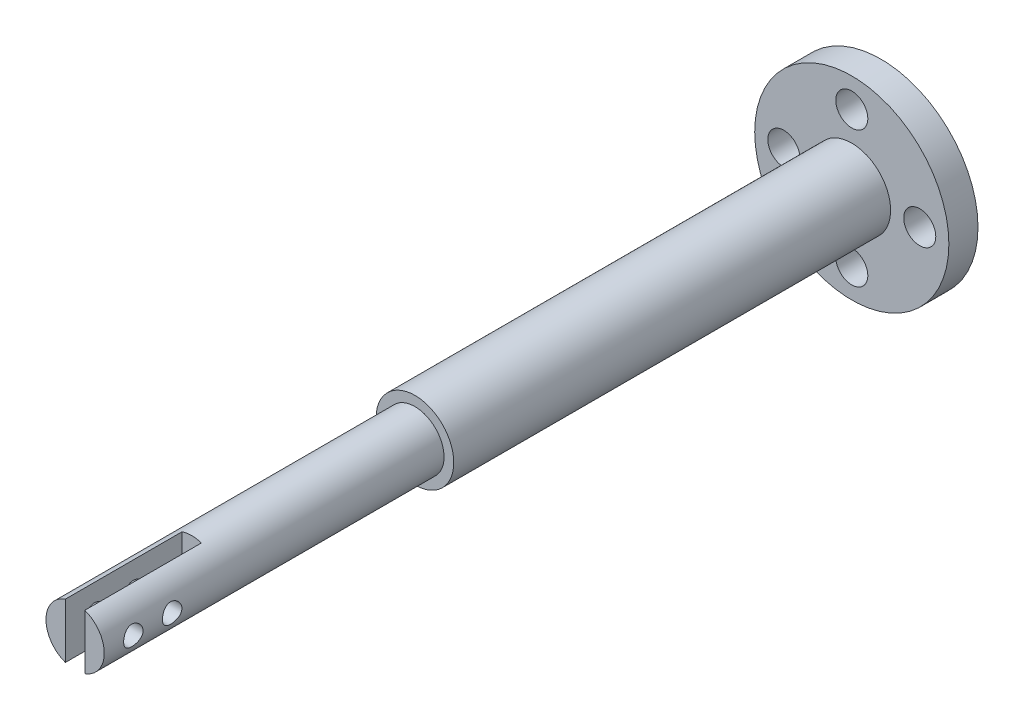
ISO-10303-21;
HEADER;
FILE_DESCRIPTION(('STEP AP214'),'2;1');
FILE_NAME('part.step','',(''),(''),'','','');
FILE_SCHEMA(('AUTOMOTIVE_DESIGN { 1 0 10303 214 1 1 1 1 }'));
ENDSEC;
DATA;
#1=APPLICATION_CONTEXT('core data for automotive mechanical design processes');
#2=APPLICATION_PROTOCOL_DEFINITION('international standard','automotive_design',2000,#1);
#3=PRODUCT_CONTEXT('',#1,'mechanical');
#4=PRODUCT('Part','Part','',(#3));
#5=PRODUCT_RELATED_PRODUCT_CATEGORY('part','',(#4));
#6=PRODUCT_DEFINITION_FORMATION('','',#4);
#7=PRODUCT_DEFINITION_CONTEXT('part definition',#1,'design');
#8=PRODUCT_DEFINITION('design','',#6,#7);
#9=PRODUCT_DEFINITION_SHAPE('','',#8);
#10=(LENGTH_UNIT() NAMED_UNIT(*) SI_UNIT(.MILLI.,.METRE.));
#11=(NAMED_UNIT(*) PLANE_ANGLE_UNIT() SI_UNIT($,.RADIAN.));
#12=(NAMED_UNIT(*) SI_UNIT($,.STERADIAN.) SOLID_ANGLE_UNIT());
#13=UNCERTAINTY_MEASURE_WITH_UNIT(LENGTH_MEASURE(1.E-05),#10,'distance_accuracy_value','');
#14=(GEOMETRIC_REPRESENTATION_CONTEXT(3) GLOBAL_UNCERTAINTY_ASSIGNED_CONTEXT((#13)) GLOBAL_UNIT_ASSIGNED_CONTEXT((#10,
#11,#12)) REPRESENTATION_CONTEXT('',''));
#15=CARTESIAN_POINT('',(0.,0.,0.));
#16=DIRECTION('',(0.,0.,1.));
#17=DIRECTION('',(1.,0.,0.));
#18=AXIS2_PLACEMENT_3D('',#15,#16,#17);
#19=CARTESIAN_POINT('',(0.,0.,3.));
#20=DIRECTION('',(0.,0.,1.));
#21=DIRECTION('',(1.,0.,0.));
#22=AXIS2_PLACEMENT_3D('',#19,#20,#21);
#23=PLANE('',#22);
#24=CARTESIAN_POINT('',(0.,0.,3.));
#25=DIRECTION('',(0.,0.,1.));
#26=DIRECTION('',(1.,0.,0.));
#27=AXIS2_PLACEMENT_3D('',#24,#25,#26);
#28=CIRCLE('',#27,4.);
#29=CARTESIAN_POINT('',(-4.,0.,3.));
#30=VERTEX_POINT('',#29);
#31=EDGE_CURVE('E243',#30,#30,#28,.T.);
#32=ORIENTED_EDGE('',*,*,#31,.F.);
#33=EDGE_LOOP('',(#32));
#34=FACE_BOUND('',#33,.T.);
#35=CARTESIAN_POINT('',(0.,-7.,3.));
#36=DIRECTION('',(0.,0.,1.));
#37=DIRECTION('',(1.,0.,0.));
#38=AXIS2_PLACEMENT_3D('',#35,#36,#37);
#39=CIRCLE('',#38,1.65);
#40=CARTESIAN_POINT('',(1.65,-7.,3.));
#41=VERTEX_POINT('',#40);
#42=EDGE_CURVE('E115',#41,#41,#39,.T.);
#43=ORIENTED_EDGE('',*,*,#42,.F.);
#44=EDGE_LOOP('',(#43));
#45=FACE_BOUND('',#44,.T.);
#46=CARTESIAN_POINT('',(0.,7.,3.));
#47=DIRECTION('',(0.,0.,1.));
#48=DIRECTION('',(1.,0.,0.));
#49=AXIS2_PLACEMENT_3D('',#46,#47,#48);
#50=CIRCLE('',#49,1.65);
#51=CARTESIAN_POINT('',(1.65,7.,3.));
#52=VERTEX_POINT('',#51);
#53=EDGE_CURVE('E127',#52,#52,#50,.T.);
#54=ORIENTED_EDGE('',*,*,#53,.F.);
#55=EDGE_LOOP('',(#54));
#56=FACE_BOUND('',#55,.T.);
#57=CARTESIAN_POINT('',(0.,0.,3.));
#58=DIRECTION('',(0.,0.,1.));
#59=DIRECTION('',(1.,0.,0.));
#60=AXIS2_PLACEMENT_3D('',#57,#58,#59);
#61=CIRCLE('',#60,10.);
#62=CARTESIAN_POINT('',(10.,0.,3.));
#63=VERTEX_POINT('',#62);
#64=EDGE_CURVE('E91',#63,#63,#61,.T.);
#65=ORIENTED_EDGE('',*,*,#64,.T.);
#66=EDGE_LOOP('',(#65));
#67=FACE_BOUND('',#66,.T.);
#68=CARTESIAN_POINT('',(7.,0.,3.));
#69=DIRECTION('',(0.,0.,1.));
#70=DIRECTION('',(1.,0.,0.));
#71=AXIS2_PLACEMENT_3D('',#68,#69,#70);
#72=CIRCLE('',#71,1.65);
#73=CARTESIAN_POINT('',(8.65,0.,3.));
#74=VERTEX_POINT('',#73);
#75=EDGE_CURVE('E121',#74,#74,#72,.T.);
#76=ORIENTED_EDGE('',*,*,#75,.F.);
#77=EDGE_LOOP('',(#76));
#78=FACE_BOUND('',#77,.T.);
#79=CARTESIAN_POINT('',(-7.,0.,3.));
#80=DIRECTION('',(0.,0.,1.));
#81=DIRECTION('',(1.,0.,0.));
#82=AXIS2_PLACEMENT_3D('',#79,#80,#81);
#83=CIRCLE('',#82,1.65);
#84=CARTESIAN_POINT('',(-5.35,0.,3.));
#85=VERTEX_POINT('',#84);
#86=EDGE_CURVE('E105',#85,#85,#83,.T.);
#87=ORIENTED_EDGE('',*,*,#86,.F.);
#88=EDGE_LOOP('',(#87));
#89=FACE_BOUND('',#88,.T.);
#90=ADVANCED_FACE('F40',(#34,#45,#56,#67,#78,#89),#23,.T.);
#91=CARTESIAN_POINT('',(0.,0.,0.));
#92=DIRECTION('',(0.,0.,1.));
#93=DIRECTION('',(1.,0.,0.));
#94=AXIS2_PLACEMENT_3D('',#91,#92,#93);
#95=PLANE('',#94);
#96=CARTESIAN_POINT('',(0.,0.,0.));
#97=DIRECTION('',(0.,0.,1.));
#98=DIRECTION('',(1.,0.,0.));
#99=AXIS2_PLACEMENT_3D('',#96,#97,#98);
#100=CIRCLE('',#99,10.);
#101=CARTESIAN_POINT('',(10.,0.,0.));
#102=VERTEX_POINT('',#101);
#103=EDGE_CURVE('E130',#102,#102,#100,.T.);
#104=ORIENTED_EDGE('',*,*,#103,.F.);
#105=EDGE_LOOP('',(#104));
#106=FACE_BOUND('',#105,.T.);
#107=CARTESIAN_POINT('',(0.,7.,0.));
#108=DIRECTION('',(0.,0.,1.));
#109=DIRECTION('',(1.,0.,0.));
#110=AXIS2_PLACEMENT_3D('',#107,#108,#109);
#111=CIRCLE('',#110,1.65);
#112=CARTESIAN_POINT('',(1.65,7.,0.));
#113=VERTEX_POINT('',#112);
#114=EDGE_CURVE('E124',#113,#113,#111,.T.);
#115=ORIENTED_EDGE('',*,*,#114,.T.);
#116=EDGE_LOOP('',(#115));
#117=FACE_BOUND('',#116,.T.);
#118=CARTESIAN_POINT('',(7.,0.,0.));
#119=DIRECTION('',(0.,0.,1.));
#120=DIRECTION('',(1.,0.,0.));
#121=AXIS2_PLACEMENT_3D('',#118,#119,#120);
#122=CIRCLE('',#121,1.65);
#123=CARTESIAN_POINT('',(8.65,0.,0.));
#124=VERTEX_POINT('',#123);
#125=EDGE_CURVE('E118',#124,#124,#122,.T.);
#126=ORIENTED_EDGE('',*,*,#125,.T.);
#127=EDGE_LOOP('',(#126));
#128=FACE_BOUND('',#127,.T.);
#129=CARTESIAN_POINT('',(0.,-7.,0.));
#130=DIRECTION('',(0.,0.,1.));
#131=DIRECTION('',(1.,0.,0.));
#132=AXIS2_PLACEMENT_3D('',#129,#130,#131);
#133=CIRCLE('',#132,1.65);
#134=CARTESIAN_POINT('',(1.65,-7.,0.));
#135=VERTEX_POINT('',#134);
#136=EDGE_CURVE('E113',#135,#135,#133,.T.);
#137=ORIENTED_EDGE('',*,*,#136,.T.);
#138=EDGE_LOOP('',(#137));
#139=FACE_BOUND('',#138,.T.);
#140=CARTESIAN_POINT('',(-7.,0.,0.));
#141=DIRECTION('',(0.,0.,1.));
#142=DIRECTION('',(1.,0.,0.));
#143=AXIS2_PLACEMENT_3D('',#140,#141,#142);
#144=CIRCLE('',#143,1.65);
#145=CARTESIAN_POINT('',(-5.35,0.,0.));
#146=VERTEX_POINT('',#145);
#147=EDGE_CURVE('E101',#146,#146,#144,.T.);
#148=ORIENTED_EDGE('',*,*,#147,.T.);
#149=EDGE_LOOP('',(#148));
#150=FACE_BOUND('',#149,.T.);
#151=ADVANCED_FACE('F203',(#106,#117,#128,#139,#150),#95,.F.);
#152=CARTESIAN_POINT('',(0.,0.,3.));
#153=DIRECTION('',(0.,0.,-1.));
#154=DIRECTION('',(-1.,0.,0.));
#155=AXIS2_PLACEMENT_3D('',#152,#153,#154);
#156=CYLINDRICAL_SURFACE('',#155,10.);
#157=ORIENTED_EDGE('',*,*,#64,.F.);
#158=EDGE_LOOP('',(#157));
#159=FACE_BOUND('',#158,.T.);
#160=ORIENTED_EDGE('',*,*,#103,.T.);
#161=EDGE_LOOP('',(#160));
#162=FACE_BOUND('',#161,.T.);
#163=ADVANCED_FACE('F42',(#159,#162),#156,.T.);
#164=CARTESIAN_POINT('',(0.,7.,3.));
#165=DIRECTION('',(0.,0.,-1.));
#166=DIRECTION('',(-1.,0.,0.));
#167=AXIS2_PLACEMENT_3D('',#164,#165,#166);
#168=CYLINDRICAL_SURFACE('',#167,1.65);
#169=ORIENTED_EDGE('',*,*,#53,.T.);
#170=EDGE_LOOP('',(#169));
#171=FACE_BOUND('',#170,.T.);
#172=ORIENTED_EDGE('',*,*,#114,.F.);
#173=EDGE_LOOP('',(#172));
#174=FACE_BOUND('',#173,.T.);
#175=ADVANCED_FACE('F213',(#171,#174),#168,.F.);
#176=CARTESIAN_POINT('',(7.,0.,3.));
#177=DIRECTION('',(0.,0.,-1.));
#178=DIRECTION('',(-1.,0.,0.));
#179=AXIS2_PLACEMENT_3D('',#176,#177,#178);
#180=CYLINDRICAL_SURFACE('',#179,1.65);
#181=ORIENTED_EDGE('',*,*,#75,.T.);
#182=EDGE_LOOP('',(#181));
#183=FACE_BOUND('',#182,.T.);
#184=ORIENTED_EDGE('',*,*,#125,.F.);
#185=EDGE_LOOP('',(#184));
#186=FACE_BOUND('',#185,.T.);
#187=ADVANCED_FACE('F216',(#183,#186),#180,.F.);
#188=CARTESIAN_POINT('',(0.,-7.,3.));
#189=DIRECTION('',(0.,0.,-1.));
#190=DIRECTION('',(-1.,0.,0.));
#191=AXIS2_PLACEMENT_3D('',#188,#189,#190);
#192=CYLINDRICAL_SURFACE('',#191,1.65);
#193=ORIENTED_EDGE('',*,*,#42,.T.);
#194=EDGE_LOOP('',(#193));
#195=FACE_BOUND('',#194,.T.);
#196=ORIENTED_EDGE('',*,*,#136,.F.);
#197=EDGE_LOOP('',(#196));
#198=FACE_BOUND('',#197,.T.);
#199=ADVANCED_FACE('F220',(#195,#198),#192,.F.);
#200=CARTESIAN_POINT('',(-7.,0.,3.));
#201=DIRECTION('',(0.,0.,-1.));
#202=DIRECTION('',(-1.,0.,0.));
#203=AXIS2_PLACEMENT_3D('',#200,#201,#202);
#204=CYLINDRICAL_SURFACE('',#203,1.65);
#205=ORIENTED_EDGE('',*,*,#86,.T.);
#206=EDGE_LOOP('',(#205));
#207=FACE_BOUND('',#206,.T.);
#208=ORIENTED_EDGE('',*,*,#147,.F.);
#209=EDGE_LOOP('',(#208));
#210=FACE_BOUND('',#209,.T.);
#211=ADVANCED_FACE('F223',(#207,#210),#204,.F.);
#212=CARTESIAN_POINT('',(0.,0.,48.));
#213=DIRECTION('',(0.,0.,-1.));
#214=DIRECTION('',(-1.,0.,0.));
#215=AXIS2_PLACEMENT_3D('',#212,#213,#214);
#216=CYLINDRICAL_SURFACE('',#215,4.);
#217=CARTESIAN_POINT('',(0.,0.,48.));
#218=DIRECTION('',(0.,0.,1.));
#219=DIRECTION('',(1.,0.,0.));
#220=AXIS2_PLACEMENT_3D('',#217,#218,#219);
#221=CIRCLE('',#220,4.);
#222=CARTESIAN_POINT('',(-4.,0.,48.));
#223=VERTEX_POINT('',#222);
#224=EDGE_CURVE('E241',#223,#223,#221,.T.);
#225=CARTESIAN_POINT('',(-4.,0.,48.));
#226=CARTESIAN_POINT('',(-4.,0.,47.53125));
#227=CARTESIAN_POINT('',(-4.,0.,47.0625));
#228=CARTESIAN_POINT('',(-4.,0.,46.125));
#229=CARTESIAN_POINT('',(-4.,0.,45.65625));
#230=CARTESIAN_POINT('',(-4.,0.,44.71875));
#231=CARTESIAN_POINT('',(-4.,0.,44.25));
#232=CARTESIAN_POINT('',(-4.,0.,43.3125));
#233=CARTESIAN_POINT('',(-4.,0.,42.84375));
#234=CARTESIAN_POINT('',(-4.,0.,41.90625));
#235=CARTESIAN_POINT('',(-4.,0.,41.4375));
#236=CARTESIAN_POINT('',(-4.,0.,40.5));
#237=CARTESIAN_POINT('',(-4.,0.,40.03125));
#238=CARTESIAN_POINT('',(-4.,0.,39.09375));
#239=CARTESIAN_POINT('',(-4.,0.,38.625));
#240=CARTESIAN_POINT('',(-4.,0.,37.6875));
#241=CARTESIAN_POINT('',(-4.,0.,37.21875));
#242=CARTESIAN_POINT('',(-4.,0.,36.28125));
#243=CARTESIAN_POINT('',(-4.,0.,35.8125));
#244=CARTESIAN_POINT('',(-4.,0.,34.875));
#245=CARTESIAN_POINT('',(-4.,0.,34.40625));
#246=CARTESIAN_POINT('',(-4.,0.,33.46875));
#247=CARTESIAN_POINT('',(-4.,0.,33.));
#248=CARTESIAN_POINT('',(-4.,0.,32.0625));
#249=CARTESIAN_POINT('',(-4.,0.,31.59375));
#250=CARTESIAN_POINT('',(-4.,0.,30.65625));
#251=CARTESIAN_POINT('',(-4.,0.,30.1875));
#252=CARTESIAN_POINT('',(-4.,0.,29.25));
#253=CARTESIAN_POINT('',(-4.,0.,28.78125));
#254=CARTESIAN_POINT('',(-4.,0.,27.84375));
#255=CARTESIAN_POINT('',(-4.,0.,27.375));
#256=CARTESIAN_POINT('',(-4.,0.,26.4375));
#257=CARTESIAN_POINT('',(-4.,0.,25.96875));
#258=CARTESIAN_POINT('',(-4.,0.,25.03125));
#259=CARTESIAN_POINT('',(-4.,0.,24.5625));
#260=CARTESIAN_POINT('',(-4.,0.,23.625));
#261=CARTESIAN_POINT('',(-4.,0.,23.15625));
#262=CARTESIAN_POINT('',(-4.,0.,22.21875));
#263=CARTESIAN_POINT('',(-4.,0.,21.75));
#264=CARTESIAN_POINT('',(-4.,0.,20.8125));
#265=CARTESIAN_POINT('',(-4.,0.,20.34375));
#266=CARTESIAN_POINT('',(-4.,0.,19.40625));
#267=CARTESIAN_POINT('',(-4.,0.,18.9375));
#268=CARTESIAN_POINT('',(-4.,0.,18.));
#269=CARTESIAN_POINT('',(-4.,0.,17.53125));
#270=CARTESIAN_POINT('',(-4.,0.,16.59375));
#271=CARTESIAN_POINT('',(-4.,0.,16.125));
#272=CARTESIAN_POINT('',(-4.,0.,15.1875));
#273=CARTESIAN_POINT('',(-4.,0.,14.71875));
#274=CARTESIAN_POINT('',(-4.,0.,13.78125));
#275=CARTESIAN_POINT('',(-4.,0.,13.3125));
#276=CARTESIAN_POINT('',(-4.,0.,12.375));
#277=CARTESIAN_POINT('',(-4.,0.,11.90625));
#278=CARTESIAN_POINT('',(-4.,0.,10.96875));
#279=CARTESIAN_POINT('',(-4.,0.,10.5));
#280=CARTESIAN_POINT('',(-4.,0.,9.5625));
#281=CARTESIAN_POINT('',(-4.,0.,9.09375));
#282=CARTESIAN_POINT('',(-4.,0.,8.15624999999999));
#283=CARTESIAN_POINT('',(-4.,0.,7.6875));
#284=CARTESIAN_POINT('',(-4.,0.,6.75));
#285=CARTESIAN_POINT('',(-4.,0.,6.28125));
#286=CARTESIAN_POINT('',(-4.,0.,5.34375));
#287=CARTESIAN_POINT('',(-4.,0.,4.87499999999999));
#288=CARTESIAN_POINT('',(-4.,0.,3.93749999999999));
#289=CARTESIAN_POINT('',(-4.,0.,3.46875));
#290=CARTESIAN_POINT('',(-4.,0.,3.));
#291=B_SPLINE_CURVE_WITH_KNOTS('',3,(#225,#226,#227,#228,#229,#230,#231,#232,#233,#234,#235,
#236,#237,#238,#239,#240,#241,#242,#243,#244,#245,#246,#247,#248,#249,#250,#251,#252,#253,#254,
#255,#256,#257,#258,#259,#260,#261,#262,#263,#264,#265,#266,#267,#268,#269,#270,#271,#272,#273,
#274,#275,#276,#277,#278,#279,#280,#281,#282,#283,#284,#285,#286,#287,#288,#289,#290),
.UNSPECIFIED.,.F.,.F.,(4,2,2,2,2,2,2,2,2,2,2,2,2,2,2,2,2,2,2,2,2,2,2,2,2,2,2,2,2,2,2,2,4),(0.,
1.40625,2.8125,4.21874999999999,5.625,7.03125,8.43749999999999,9.84375,11.25,12.65625,14.0625,
15.46875,16.875,18.28125,19.6875,21.09375,22.5,23.90625,25.3125,26.71875,28.125,29.53125,
30.9375,32.34375,33.75,35.15625,36.5625,37.96875,39.375,40.78125,42.1875,43.59375,45.),.UNSPECIFIED.);
#292=EDGE_CURVE('BSEAM197',#223,#30,#291,.T.);
#293=ORIENTED_EDGE('',*,*,#224,.F.);
#294=ORIENTED_EDGE('',*,*,#31,.T.);
#295=ORIENTED_EDGE('',*,*,#292,.T.);
#296=ORIENTED_EDGE('',*,*,#292,.F.);
#297=EDGE_LOOP('',(#293,#295,#294,#296));
#298=FACE_BOUND('',#297,.T.);
#299=ADVANCED_FACE('F197',(#298),#216,.T.);
#300=CARTESIAN_POINT('',(0.,0.,48.));
#301=DIRECTION('',(0.,0.,1.));
#302=DIRECTION('',(1.,0.,0.));
#303=AXIS2_PLACEMENT_3D('',#300,#301,#302);
#304=PLANE('',#303);
#305=CARTESIAN_POINT('',(0.,0.,48.));
#306=DIRECTION('',(0.,0.,1.));
#307=DIRECTION('',(1.,0.,0.));
#308=AXIS2_PLACEMENT_3D('',#305,#306,#307);
#309=CIRCLE('',#308,3.);
#310=CARTESIAN_POINT('',(3.,0.,48.));
#311=VERTEX_POINT('',#310);
#312=EDGE_CURVE('E44',#311,#311,#309,.T.);
#313=ORIENTED_EDGE('',*,*,#312,.F.);
#314=EDGE_LOOP('',(#313));
#315=FACE_BOUND('',#314,.T.);
#316=ORIENTED_EDGE('',*,*,#224,.T.);
#317=EDGE_LOOP('',(#316));
#318=FACE_BOUND('',#317,.T.);
#319=ADVANCED_FACE('F193',(#315,#318),#304,.T.);
#320=CARTESIAN_POINT('',(0.,0.,83.));
#321=DIRECTION('',(0.,0.,1.));
#322=DIRECTION('',(1.,0.,0.));
#323=AXIS2_PLACEMENT_3D('',#320,#321,#322);
#324=PLANE('',#323);
#325=DIRECTION('',(0.,-1.,0.));
#326=VECTOR('',#325,1.);
#327=CARTESIAN_POINT('',(-1.,0.,83.));
#328=LINE('',#327,#326);
#329=CARTESIAN_POINT('',(-1.,2.82842712474619,83.));
#330=VERTEX_POINT('',#329);
#331=CARTESIAN_POINT('',(-1.,-2.82842712474619,83.));
#332=VERTEX_POINT('',#331);
#333=EDGE_CURVE('E82',#330,#332,#328,.T.);
#334=ORIENTED_EDGE('',*,*,#333,.F.);
#335=CARTESIAN_POINT('',(0.,0.,83.));
#336=DIRECTION('',(0.,0.,1.));
#337=DIRECTION('',(1.,0.,0.));
#338=AXIS2_PLACEMENT_3D('',#335,#336,#337);
#339=CIRCLE('',#338,3.);
#340=EDGE_CURVE('E96',#330,#332,#339,.T.);
#341=ORIENTED_EDGE('',*,*,#340,.T.);
#342=EDGE_LOOP('',(#334,#341));
#343=FACE_BOUND('',#342,.T.);
#344=ADVANCED_FACE('F100',(#343),#324,.T.);
#345=CARTESIAN_POINT('',(-1.,-3.87167745645733,71.));
#346=DIRECTION('',(-1.,0.,0.));
#347=DIRECTION('',(0.,0.,1.));
#348=AXIS2_PLACEMENT_3D('',#345,#346,#347);
#349=PLANE('',#348);
#350=CARTESIAN_POINT('',(-1.,0.,80.));
#351=DIRECTION('',(-1.,0.,0.));
#352=DIRECTION('',(0.,0.,1.));
#353=AXIS2_PLACEMENT_3D('',#350,#351,#352);
#354=CIRCLE('',#353,0.999999999999998);
#355=CARTESIAN_POINT('',(-1.,0.,81.));
#356=VERTEX_POINT('',#355);
#357=EDGE_CURVE('E141',#356,#356,#354,.T.);
#358=ORIENTED_EDGE('',*,*,#357,.T.);
#359=EDGE_LOOP('',(#358));
#360=FACE_BOUND('',#359,.T.);
#361=CARTESIAN_POINT('',(-1.,0.,76.));
#362=DIRECTION('',(-1.,0.,0.));
#363=DIRECTION('',(0.,0.,1.));
#364=AXIS2_PLACEMENT_3D('',#361,#362,#363);
#365=CIRCLE('',#364,0.999999999999998);
#366=CARTESIAN_POINT('',(-1.,0.,77.));
#367=VERTEX_POINT('',#366);
#368=EDGE_CURVE('E138',#367,#367,#365,.T.);
#369=ORIENTED_EDGE('',*,*,#368,.T.);
#370=EDGE_LOOP('',(#369));
#371=FACE_BOUND('',#370,.T.);
#372=ORIENTED_EDGE('',*,*,#333,.T.);
#373=DIRECTION('',(0.,0.,-1.));
#374=VECTOR('',#373,1.);
#375=CARTESIAN_POINT('',(-1.,-2.82842712474619,83.));
#376=LINE('',#375,#374);
#377=CARTESIAN_POINT('',(-1.,-2.82842712474619,71.));
#378=VERTEX_POINT('',#377);
#379=EDGE_CURVE('E85',#378,#332,#376,.F.);
#380=ORIENTED_EDGE('',*,*,#379,.F.);
#381=DIRECTION('',(0.,-1.,0.));
#382=VECTOR('',#381,1.);
#383=CARTESIAN_POINT('',(-1.,-3.87167745645733,71.));
#384=LINE('',#383,#382);
#385=CARTESIAN_POINT('',(-1.,2.82842712474619,71.));
#386=VERTEX_POINT('',#385);
#387=EDGE_CURVE('E98',#386,#378,#384,.T.);
#388=ORIENTED_EDGE('',*,*,#387,.F.);
#389=DIRECTION('',(0.,0.,-1.));
#390=VECTOR('',#389,1.);
#391=CARTESIAN_POINT('',(-1.,2.82842712474619,83.));
#392=LINE('',#391,#390);
#393=EDGE_CURVE('E57',#330,#386,#392,.T.);
#394=ORIENTED_EDGE('',*,*,#393,.F.);
#395=EDGE_LOOP('',(#372,#380,#388,#394));
#396=FACE_BOUND('',#395,.T.);
#397=ADVANCED_FACE('F84',(#360,#371,#396),#349,.F.);
#398=DIRECTION('',(0.,1.,0.));
#399=VECTOR('',#398,1.);
#400=CARTESIAN_POINT('',(1.,0.,83.));
#401=LINE('',#400,#399);
#402=CARTESIAN_POINT('',(1.,-2.82842712474619,83.));
#403=VERTEX_POINT('',#402);
#404=CARTESIAN_POINT('',(1.,2.82842712474619,83.));
#405=VERTEX_POINT('',#404);
#406=EDGE_CURVE('E90',#403,#405,#401,.T.);
#407=ORIENTED_EDGE('',*,*,#406,.F.);
#408=EDGE_CURVE('E102',#403,#405,#339,.T.);
#409=ORIENTED_EDGE('',*,*,#408,.T.);
#410=EDGE_LOOP('',(#407,#409));
#411=FACE_BOUND('',#410,.T.);
#412=ADVANCED_FACE('F189',(#411),#324,.T.);
#413=CARTESIAN_POINT('',(1.,-3.87167745645733,71.));
#414=DIRECTION('',(1.,0.,0.));
#415=DIRECTION('',(0.,0.,-1.));
#416=AXIS2_PLACEMENT_3D('',#413,#414,#415);
#417=PLANE('',#416);
#418=CARTESIAN_POINT('',(1.,0.,80.));
#419=DIRECTION('',(1.,0.,0.));
#420=DIRECTION('',(0.,0.,-1.));
#421=AXIS2_PLACEMENT_3D('',#418,#419,#420);
#422=CIRCLE('',#421,0.999999999999998);
#423=CARTESIAN_POINT('',(1.,0.,79.));
#424=VERTEX_POINT('',#423);
#425=EDGE_CURVE('E143',#424,#424,#422,.T.);
#426=ORIENTED_EDGE('',*,*,#425,.T.);
#427=EDGE_LOOP('',(#426));
#428=FACE_BOUND('',#427,.T.);
#429=CARTESIAN_POINT('',(1.,0.,76.));
#430=DIRECTION('',(1.,0.,0.));
#431=DIRECTION('',(0.,0.,-1.));
#432=AXIS2_PLACEMENT_3D('',#429,#430,#431);
#433=CIRCLE('',#432,0.999999999999998);
#434=CARTESIAN_POINT('',(1.,0.,75.));
#435=VERTEX_POINT('',#434);
#436=EDGE_CURVE('E140',#435,#435,#433,.T.);
#437=ORIENTED_EDGE('',*,*,#436,.T.);
#438=EDGE_LOOP('',(#437));
#439=FACE_BOUND('',#438,.T.);
#440=ORIENTED_EDGE('',*,*,#406,.T.);
#441=DIRECTION('',(0.,0.,-1.));
#442=VECTOR('',#441,1.);
#443=CARTESIAN_POINT('',(1.,2.82842712474619,83.));
#444=LINE('',#443,#442);
#445=CARTESIAN_POINT('',(1.,2.82842712474619,71.));
#446=VERTEX_POINT('',#445);
#447=EDGE_CURVE('E65',#446,#405,#444,.F.);
#448=ORIENTED_EDGE('',*,*,#447,.F.);
#449=DIRECTION('',(0.,1.,0.));
#450=VECTOR('',#449,1.);
#451=CARTESIAN_POINT('',(1.,-3.87167745645733,71.));
#452=LINE('',#451,#450);
#453=CARTESIAN_POINT('',(1.,-2.82842712474619,71.));
#454=VERTEX_POINT('',#453);
#455=EDGE_CURVE('E270',#454,#446,#452,.T.);
#456=ORIENTED_EDGE('',*,*,#455,.F.);
#457=DIRECTION('',(0.,0.,-1.));
#458=VECTOR('',#457,1.);
#459=CARTESIAN_POINT('',(1.,-2.82842712474619,83.));
#460=LINE('',#459,#458);
#461=EDGE_CURVE('E108',#403,#454,#460,.T.);
#462=ORIENTED_EDGE('',*,*,#461,.F.);
#463=EDGE_LOOP('',(#440,#448,#456,#462));
#464=FACE_BOUND('',#463,.T.);
#465=ADVANCED_FACE('F185',(#428,#439,#464),#417,.F.);
#466=CARTESIAN_POINT('',(0.,0.,71.));
#467=DIRECTION('',(0.,0.,-1.));
#468=DIRECTION('',(-1.,0.,0.));
#469=AXIS2_PLACEMENT_3D('',#466,#467,#468);
#470=PLANE('',#469);
#471=ORIENTED_EDGE('',*,*,#387,.T.);
#472=CARTESIAN_POINT('',(0.,0.,71.));
#473=DIRECTION('',(0.,0.,-1.));
#474=DIRECTION('',(-1.,0.,0.));
#475=AXIS2_PLACEMENT_3D('',#472,#473,#474);
#476=CIRCLE('',#475,3.);
#477=EDGE_CURVE('E49',#454,#378,#476,.T.);
#478=ORIENTED_EDGE('',*,*,#477,.F.);
#479=ORIENTED_EDGE('',*,*,#455,.T.);
#480=EDGE_CURVE('E11',#386,#446,#476,.T.);
#481=ORIENTED_EDGE('',*,*,#480,.F.);
#482=EDGE_LOOP('',(#471,#478,#479,#481));
#483=FACE_BOUND('',#482,.T.);
#484=ADVANCED_FACE('F181',(#483),#470,.F.);
#485=CARTESIAN_POINT('',(-6.,0.,76.));
#486=DIRECTION('',(1.,0.,0.));
#487=DIRECTION('',(0.,0.,-1.));
#488=AXIS2_PLACEMENT_3D('',#485,#486,#487);
#489=CYLINDRICAL_SURFACE('',#488,0.999999999999998);
#490=ORIENTED_EDGE('',*,*,#436,.F.);
#491=EDGE_LOOP('',(#490));
#492=FACE_BOUND('',#491,.T.);
#493=CARTESIAN_POINT('',(3.,0.,75.));
#494=CARTESIAN_POINT('',(3.00000015300943,-0.0545633628867229,74.9999997462684));
#495=CARTESIAN_POINT('',(2.99849769507545,-0.109125194538549,75.0044802661272));
#496=CARTESIAN_POINT('',(2.99265210203281,-0.21664176087297,75.0222291088172));
#497=CARTESIAN_POINT('',(2.98830867202153,-0.269596328118816,75.0354983439489));
#498=CARTESIAN_POINT('',(2.97725307906443,-0.372332789501776,75.070319243384));
#499=CARTESIAN_POINT('',(2.97054487730853,-0.422119825886035,75.0918570624593));
#500=CARTESIAN_POINT('',(2.95544445717342,-0.517374936805327,75.1425411728383));
#501=CARTESIAN_POINT('',(2.94705190667778,-0.562842156958707,75.1716889650026));
#502=CARTESIAN_POINT('',(2.92914094443005,-0.649741675022266,75.2378258048587));
#503=CARTESIAN_POINT('',(2.91959556463785,-0.691003700298307,75.2750312342605));
#504=CARTESIAN_POINT('',(2.90060314783122,-0.766832692702081,75.3557671547066));
#505=CARTESIAN_POINT('',(2.89115613290549,-0.80139818548946,75.3992990349285));
#506=CARTESIAN_POINT('',(2.87313332477274,-0.863824942227858,75.4929851151964));
#507=CARTESIAN_POINT('',(2.86459039275688,-0.891464858221031,75.5432937397321));
#508=CARTESIAN_POINT('',(2.84975305418601,-0.93781887387772,75.6481760944585));
#509=CARTESIAN_POINT('',(2.84345796160746,-0.956535697386762,75.7027485171627));
#510=CARTESIAN_POINT('',(2.83411303269377,-0.983873461509162,75.8126732214967));
#511=CARTESIAN_POINT('',(2.83096095769611,-0.992813448271768,75.8679372084891));
#512=CARTESIAN_POINT('',(2.82795656629508,-1.00134112333448,75.9792637541559));
#513=CARTESIAN_POINT('',(2.8281032302273,-1.00093170160472,76.0353260607092));
#514=CARTESIAN_POINT('',(2.8315901500818,-0.991019903703416,76.143936630444));
#515=CARTESIAN_POINT('',(2.83478415867533,-0.981933913166992,76.196528402919));
#516=CARTESIAN_POINT('',(2.84376657724551,-0.955606162849415,76.2993934196068));
#517=CARTESIAN_POINT('',(2.84955529784108,-0.93836342659187,76.3496663854351));
#518=CARTESIAN_POINT('',(2.86317911131249,-0.895939058060209,76.4474127495915));
#519=CARTESIAN_POINT('',(2.87104565793118,-0.870634048707256,76.4948280254695));
#520=CARTESIAN_POINT('',(2.88792558575727,-0.812889106303132,76.5848709082797));
#521=CARTESIAN_POINT('',(2.89693929790464,-0.780447112364002,76.6274971269334));
#522=CARTESIAN_POINT('',(2.91567329167741,-0.707349332682236,76.7090915981608));
#523=CARTESIAN_POINT('',(2.92540589354843,-0.666353150076308,76.7477526945091));
#524=CARTESIAN_POINT('',(2.94406938387037,-0.578339569970058,76.8177312666634));
#525=CARTESIAN_POINT('',(2.95300019538068,-0.531321595660809,76.8490480381645));
#526=CARTESIAN_POINT('',(2.96917107937794,-0.431947613046264,76.9036963002351));
#527=CARTESIAN_POINT('',(2.9763935000804,-0.379543276416334,76.9269454913407));
#528=CARTESIAN_POINT('',(2.98820567144435,-0.271269083364507,76.9642031739557));
#529=CARTESIAN_POINT('',(2.99279633654878,-0.215400438154954,76.9782148754234));
#530=CARTESIAN_POINT('',(2.99867627071441,-0.104383829529306,76.9960556660223));
#531=CARTESIAN_POINT('',(3.00010001833731,-0.0493095998648474,77.0002998091727));
#532=CARTESIAN_POINT('',(2.99988902694825,0.0607750699602345,76.9996673264015));
#533=CARTESIAN_POINT('',(2.99825480419352,0.115785519319646,76.9947922400201));
#534=CARTESIAN_POINT('',(2.99220024717114,0.222519866304258,76.976388092264));
#535=CARTESIAN_POINT('',(2.98786198711228,0.274292806834856,76.9631137939505));
#536=CARTESIAN_POINT('',(2.97691846830034,0.37485595857956,76.9286065555333));
#537=CARTESIAN_POINT('',(2.97031292046541,0.423645788508557,76.9073726005323));
#538=CARTESIAN_POINT('',(2.95528931287427,0.518288296393322,76.8569295681591));
#539=CARTESIAN_POINT('',(2.94682814756305,0.564029959217335,76.8275254067164));
#540=CARTESIAN_POINT('',(2.92905253915743,0.65006483013541,76.7618058499869));
#541=CARTESIAN_POINT('',(2.91973783591888,0.690356367794896,76.7254883439698));
#542=CARTESIAN_POINT('',(2.90076847982472,0.766252507807014,76.6450212489917));
#543=CARTESIAN_POINT('',(2.89111761095155,0.801560969248494,76.6005907730667));
#544=CARTESIAN_POINT('',(2.87299973286981,0.864257522320855,76.5062284321955));
#545=CARTESIAN_POINT('',(2.8645327335312,0.891645547920842,76.4562965213898));
#546=CARTESIAN_POINT('',(2.84982391820308,0.937596930423356,76.3523269846934));
#547=CARTESIAN_POINT('',(2.84357760900632,0.95617813219776,76.2982979207572));
#548=CARTESIAN_POINT('',(2.83410832399134,0.983894666792159,76.1876213498759));
#549=CARTESIAN_POINT('',(2.83088398622699,0.993034254961241,76.1309750345669));
#550=CARTESIAN_POINT('',(2.82797858875071,1.00127628247038,76.0198029039868));
#551=CARTESIAN_POINT('',(2.82812400344299,1.00087025731093,75.9653176597483));
#552=CARTESIAN_POINT('',(2.8315126992356,0.991242293454876,75.8572349251003));
#553=CARTESIAN_POINT('',(2.83475579595884,0.982020879458884,75.8036373820471));
#554=CARTESIAN_POINT('',(2.84384524278944,0.955371813126978,75.6998643369873));
#555=CARTESIAN_POINT('',(2.84964098015514,0.938103346014875,75.6496431749928));
#556=CARTESIAN_POINT('',(2.86316398825434,0.895979365760374,75.5527725930644));
#557=CARTESIAN_POINT('',(2.87089168765297,0.871122168553971,75.5061239688127));
#558=CARTESIAN_POINT('',(2.8878282922406,0.81326069258324,75.4155163300763));
#559=CARTESIAN_POINT('',(2.89708711641604,0.779948242764523,75.3717634981014));
#560=CARTESIAN_POINT('',(2.91583356283786,0.706642883135691,75.290310186616));
#561=CARTESIAN_POINT('',(2.92532124912518,0.666648084451492,75.252611424312));
#562=CARTESIAN_POINT('',(2.94390030525393,0.579241556920674,75.1828555877108));
#563=CARTESIAN_POINT('',(2.95296181801216,0.531601513499723,75.151075652249));
#564=CARTESIAN_POINT('',(2.96925991172653,0.431357357406624,75.0960095711494));
#565=CARTESIAN_POINT('',(2.97649695907941,0.378754518132346,75.072721254078));
#566=CARTESIAN_POINT('',(2.98805515068532,0.272493647200972,75.0362783675113));
#567=CARTESIAN_POINT('',(2.9924921242252,0.218987757676405,75.0227175337366));
#568=CARTESIAN_POINT('',(2.99846407064225,0.110320416010245,75.0045797193229));
#569=CARTESIAN_POINT('',(2.99999984531906,0.0551594255687453,75.0000002565035));
#570=CARTESIAN_POINT('',(3.,0.,75.));
#571=B_SPLINE_CURVE_WITH_KNOTS('',3,(#493,#494,#495,#496,#497,#498,#499,#500,#501,#502,#503,
#504,#505,#506,#507,#508,#509,#510,#511,#512,#513,#514,#515,#516,#517,#518,#519,#520,#521,#522,
#523,#524,#525,#526,#527,#528,#529,#530,#531,#532,#533,#534,#535,#536,#537,#538,#539,#540,#541,
#542,#543,#544,#545,#546,#547,#548,#549,#550,#551,#552,#553,#554,#555,#556,#557,#558,#559,#560,
#561,#562,#563,#564,#565,#566,#567,#568,#569,#570),.UNSPECIFIED.,.T.,.F.,(4,2,2,2,2,2,2,2,2,2,2,
2,2,2,2,2,2,2,2,2,2,2,2,2,2,2,2,2,2,2,2,2,2,2,2,2,2,2,4),(0.,0.16348710602601,0.32699118526752,
0.490222672870272,0.653486377799098,0.82184684282756,0.990244332875296,1.1634838482347,
1.33667044692833,1.5040192574184,1.67131633987485,1.83096826551281,1.99063930855482,
2.15288171155131,2.31517102558207,2.48593305811367,2.65671145966618,2.82918405650357,
3.00159668877207,3.16653583175169,3.33144713164176,3.49158157978213,3.65173645284103,
3.81610399843736,3.98052180821891,4.15241022880752,4.32430008234996,4.49584013824414,
4.66730284700845,4.82995666056618,4.99260079341184,5.15215587070228,5.31174638165788,
5.47830066681615,5.64490211113588,5.8179966082491,5.99104681142266,6.15636558363623,
6.32163866027949),.UNSPECIFIED.);
#572=CARTESIAN_POINT('',(3.,0.,75.));
#573=VERTEX_POINT('',#572);
#574=EDGE_CURVE('E151',#573,#573,#571,.T.);
#575=ORIENTED_EDGE('',*,*,#574,.F.);
#576=EDGE_LOOP('',(#575));
#577=FACE_BOUND('',#576,.T.);
#578=ADVANCED_FACE('F176',(#492,#577),#489,.F.);
#579=ORIENTED_EDGE('',*,*,#368,.F.);
#580=EDGE_LOOP('',(#579));
#581=FACE_BOUND('',#580,.T.);
#582=CARTESIAN_POINT('',(-3.,0.,77.));
#583=CARTESIAN_POINT('',(-3.00000015300943,-0.0545633628867229,77.0000002537316));
#584=CARTESIAN_POINT('',(-2.99849769507545,-0.109125194538549,76.9955197338728));
#585=CARTESIAN_POINT('',(-2.99265210203281,-0.21664176087297,76.9777708911828));
#586=CARTESIAN_POINT('',(-2.98830867202153,-0.269596328118816,76.9645016560511));
#587=CARTESIAN_POINT('',(-2.97725307906443,-0.372332789501776,76.929680756616));
#588=CARTESIAN_POINT('',(-2.97054487730853,-0.422119825886035,76.9081429375407));
#589=CARTESIAN_POINT('',(-2.95544445717342,-0.517374936805327,76.8574588271617));
#590=CARTESIAN_POINT('',(-2.94705190667778,-0.562842156958707,76.8283110349974));
#591=CARTESIAN_POINT('',(-2.92914094443005,-0.649741675022266,76.7621741951413));
#592=CARTESIAN_POINT('',(-2.91959556463785,-0.691003700298307,76.7249687657395));
#593=CARTESIAN_POINT('',(-2.90060314783122,-0.76683269270208,76.6442328452934));
#594=CARTESIAN_POINT('',(-2.89115613290549,-0.80139818548946,76.6007009650715));
#595=CARTESIAN_POINT('',(-2.87313332477274,-0.863824942227856,76.5070148848036));
#596=CARTESIAN_POINT('',(-2.86459039275688,-0.891464858221028,76.4567062602679));
#597=CARTESIAN_POINT('',(-2.84975305418601,-0.937818873877718,76.3518239055415));
#598=CARTESIAN_POINT('',(-2.84345796160746,-0.956535697386762,76.2972514828373));
#599=CARTESIAN_POINT('',(-2.83411303269377,-0.98387346150916,76.1873267785033));
#600=CARTESIAN_POINT('',(-2.83096095769611,-0.992813448271767,76.1320627915109));
#601=CARTESIAN_POINT('',(-2.82795656629508,-1.00134112333448,76.0207362458441));
#602=CARTESIAN_POINT('',(-2.8281032302273,-1.00093170160472,75.9646739392908));
#603=CARTESIAN_POINT('',(-2.8315901500818,-0.991019903703416,75.856063369556));
#604=CARTESIAN_POINT('',(-2.83478415867533,-0.981933913166992,75.803471597081));
#605=CARTESIAN_POINT('',(-2.84376657724551,-0.955606162849415,75.7006065803932));
#606=CARTESIAN_POINT('',(-2.84955529784108,-0.93836342659187,75.6503336145649));
#607=CARTESIAN_POINT('',(-2.86317911131249,-0.895939058060209,75.5525872504085));
#608=CARTESIAN_POINT('',(-2.87104565793118,-0.870634048707256,75.5051719745305));
#609=CARTESIAN_POINT('',(-2.88792558575727,-0.812889106303132,75.4151290917203));
#610=CARTESIAN_POINT('',(-2.89693929790464,-0.780447112364002,75.3725028730666));
#611=CARTESIAN_POINT('',(-2.91567329167741,-0.707349332682236,75.2909084018392));
#612=CARTESIAN_POINT('',(-2.92540589354843,-0.666353150076308,75.2522473054909));
#613=CARTESIAN_POINT('',(-2.94406938387037,-0.578339569970058,75.1822687333366));
#614=CARTESIAN_POINT('',(-2.95300019538068,-0.531321595660809,75.1509519618355));
#615=CARTESIAN_POINT('',(-2.96917107937794,-0.431947613046264,75.0963036997649));
#616=CARTESIAN_POINT('',(-2.9763935000804,-0.379543276416334,75.0730545086593));
#617=CARTESIAN_POINT('',(-2.98820567144435,-0.271269083364507,75.0357968260443));
#618=CARTESIAN_POINT('',(-2.99279633654878,-0.215400438154954,75.0217851245766));
#619=CARTESIAN_POINT('',(-2.99867627071441,-0.104383829529306,75.0039443339777));
#620=CARTESIAN_POINT('',(-3.00010001833731,-0.0493095998648474,74.9997001908273));
#621=CARTESIAN_POINT('',(-2.99988902694825,0.0607750699602345,75.0003326735985));
#622=CARTESIAN_POINT('',(-2.99825480419352,0.115785519319646,75.0052077599799));
#623=CARTESIAN_POINT('',(-2.99220024717114,0.222519866304258,75.023611907736));
#624=CARTESIAN_POINT('',(-2.98786198711228,0.274292806834856,75.0368862060495));
#625=CARTESIAN_POINT('',(-2.97691846830034,0.37485595857956,75.0713934444667));
#626=CARTESIAN_POINT('',(-2.97031292046541,0.423645788508557,75.0926273994677));
#627=CARTESIAN_POINT('',(-2.95528931287427,0.518288296393322,75.1430704318409));
#628=CARTESIAN_POINT('',(-2.94682814756305,0.564029959217335,75.1724745932836));
#629=CARTESIAN_POINT('',(-2.92905253915743,0.65006483013541,75.2381941500131));
#630=CARTESIAN_POINT('',(-2.91973783591888,0.690356367794896,75.2745116560302));
#631=CARTESIAN_POINT('',(-2.90076847982472,0.766252507807014,75.3549787510083));
#632=CARTESIAN_POINT('',(-2.89111761095155,0.801560969248494,75.3994092269332));
#633=CARTESIAN_POINT('',(-2.87299973286981,0.864257522320855,75.4937715678045));
#634=CARTESIAN_POINT('',(-2.8645327335312,0.891645547920842,75.5437034786102));
#635=CARTESIAN_POINT('',(-2.84982391820308,0.937596930423359,75.6476730153066));
#636=CARTESIAN_POINT('',(-2.84357760900632,0.956178132197766,75.7017020792428));
#637=CARTESIAN_POINT('',(-2.83410832399133,0.983894666792161,75.8123786501241));
#638=CARTESIAN_POINT('',(-2.83088398622699,0.993034254961241,75.8690249654331));
#639=CARTESIAN_POINT('',(-2.82797858875071,1.00127628247038,75.9801970960132));
#640=CARTESIAN_POINT('',(-2.82812400344299,1.00087025731093,76.0346823402517));
#641=CARTESIAN_POINT('',(-2.8315126992356,0.991242293454876,76.1427650748997));
#642=CARTESIAN_POINT('',(-2.83475579595884,0.982020879458884,76.1963626179529));
#643=CARTESIAN_POINT('',(-2.84384524278944,0.955371813126978,76.3001356630127));
#644=CARTESIAN_POINT('',(-2.84964098015514,0.938103346014875,76.3503568250072));
#645=CARTESIAN_POINT('',(-2.86316398825434,0.895979365760374,76.4472274069356));
#646=CARTESIAN_POINT('',(-2.87089168765297,0.871122168553971,76.4938760311873));
#647=CARTESIAN_POINT('',(-2.8878282922406,0.81326069258324,76.5844836699237));
#648=CARTESIAN_POINT('',(-2.89708711641604,0.779948242764523,76.6282365018986));
#649=CARTESIAN_POINT('',(-2.91583356283786,0.706642883135691,76.709689813384));
#650=CARTESIAN_POINT('',(-2.92532124912518,0.666648084451492,76.747388575688));
#651=CARTESIAN_POINT('',(-2.94390030525393,0.579241556920674,76.8171444122892));
#652=CARTESIAN_POINT('',(-2.95296181801216,0.531601513499723,76.848924347751));
#653=CARTESIAN_POINT('',(-2.96925991172653,0.431357357406624,76.9039904288506));
#654=CARTESIAN_POINT('',(-2.97649695907941,0.378754518132346,76.927278745922));
#655=CARTESIAN_POINT('',(-2.98805515068532,0.272493647200972,76.9637216324887));
#656=CARTESIAN_POINT('',(-2.9924921242252,0.218987757676405,76.9772824662634));
#657=CARTESIAN_POINT('',(-2.99846407064225,0.110320416010245,76.9954202806771));
#658=CARTESIAN_POINT('',(-2.99999984531906,0.0551594255687453,76.9999997434965));
#659=CARTESIAN_POINT('',(-3.,0.,77.));
#660=B_SPLINE_CURVE_WITH_KNOTS('',3,(#582,#583,#584,#585,#586,#587,#588,#589,#590,#591,#592,
#593,#594,#595,#596,#597,#598,#599,#600,#601,#602,#603,#604,#605,#606,#607,#608,#609,#610,#611,
#612,#613,#614,#615,#616,#617,#618,#619,#620,#621,#622,#623,#624,#625,#626,#627,#628,#629,#630,
#631,#632,#633,#634,#635,#636,#637,#638,#639,#640,#641,#642,#643,#644,#645,#646,#647,#648,#649,
#650,#651,#652,#653,#654,#655,#656,#657,#658,#659),.UNSPECIFIED.,.T.,.F.,(4,2,2,2,2,2,2,2,2,2,2,
2,2,2,2,2,2,2,2,2,2,2,2,2,2,2,2,2,2,2,2,2,2,2,2,2,2,2,4),(0.,0.16348710602601,0.32699118526752,
0.490222672870272,0.653486377799098,0.82184684282756,0.990244332875296,1.16348384823469,
1.33667044692833,1.50401925741839,1.67131633987485,1.83096826551281,1.99063930855482,
2.15288171155131,2.31517102558207,2.48593305811367,2.65671145966618,2.82918405650357,
3.00159668877207,3.16653583175169,3.33144713164176,3.49158157978213,3.65173645284103,
3.81610399843736,3.98052180821891,4.15241022880752,4.32430008234996,4.49584013824416,
4.66730284700845,4.82995666056618,4.99260079341184,5.15215587070228,5.31174638165788,
5.47830066681615,5.64490211113588,5.8179966082491,5.99104681142266,6.15636558363623,
6.32163866027949),.UNSPECIFIED.);
#661=CARTESIAN_POINT('',(-3.,0.,77.));
#662=VERTEX_POINT('',#661);
#663=EDGE_CURVE('E144',#662,#662,#660,.T.);
#664=ORIENTED_EDGE('',*,*,#663,.F.);
#665=EDGE_LOOP('',(#664));
#666=FACE_BOUND('',#665,.T.);
#667=ADVANCED_FACE('F170',(#581,#666),#489,.F.);
#668=CARTESIAN_POINT('',(-6.,0.,80.));
#669=DIRECTION('',(1.,0.,0.));
#670=DIRECTION('',(0.,0.,-1.));
#671=AXIS2_PLACEMENT_3D('',#668,#669,#670);
#672=CYLINDRICAL_SURFACE('',#671,0.999999999999998);
#673=ORIENTED_EDGE('',*,*,#425,.F.);
#674=EDGE_LOOP('',(#673));
#675=FACE_BOUND('',#674,.T.);
#676=CARTESIAN_POINT('',(3.,0.,79.));
#677=CARTESIAN_POINT('',(3.00000015300943,-0.0545633628867229,78.9999997462684));
#678=CARTESIAN_POINT('',(2.99849769507545,-0.109125194538549,79.0044802661272));
#679=CARTESIAN_POINT('',(2.99265210203281,-0.21664176087297,79.0222291088172));
#680=CARTESIAN_POINT('',(2.98830867202153,-0.269596328118816,79.0354983439489));
#681=CARTESIAN_POINT('',(2.97725307906443,-0.372332789501776,79.070319243384));
#682=CARTESIAN_POINT('',(2.97054487730853,-0.422119825886035,79.0918570624593));
#683=CARTESIAN_POINT('',(2.95544445717342,-0.517374936805327,79.1425411728383));
#684=CARTESIAN_POINT('',(2.94705190667778,-0.562842156958707,79.1716889650026));
#685=CARTESIAN_POINT('',(2.92914094443005,-0.649741675022266,79.2378258048587));
#686=CARTESIAN_POINT('',(2.91959556463785,-0.691003700298307,79.2750312342605));
#687=CARTESIAN_POINT('',(2.90060314783122,-0.76683269270208,79.3557671547066));
#688=CARTESIAN_POINT('',(2.89115613290549,-0.80139818548946,79.3992990349285));
#689=CARTESIAN_POINT('',(2.87313332477274,-0.863824942227856,79.4929851151964));
#690=CARTESIAN_POINT('',(2.86459039275688,-0.891464858221028,79.5432937397321));
#691=CARTESIAN_POINT('',(2.84975305418601,-0.937818873877718,79.6481760944585));
#692=CARTESIAN_POINT('',(2.84345796160746,-0.956535697386762,79.7027485171627));
#693=CARTESIAN_POINT('',(2.83411303269377,-0.983873461509161,79.8126732214967));
#694=CARTESIAN_POINT('',(2.83096095769611,-0.992813448271768,79.8679372084891));
#695=CARTESIAN_POINT('',(2.82795656629508,-1.00134112333448,79.9792637541559));
#696=CARTESIAN_POINT('',(2.8281032302273,-1.00093170160472,80.0353260607092));
#697=CARTESIAN_POINT('',(2.8315901500818,-0.991019903703416,80.143936630444));
#698=CARTESIAN_POINT('',(2.83478415867533,-0.981933913166992,80.196528402919));
#699=CARTESIAN_POINT('',(2.84376657724551,-0.955606162849415,80.2993934196068));
#700=CARTESIAN_POINT('',(2.84955529784108,-0.93836342659187,80.3496663854351));
#701=CARTESIAN_POINT('',(2.86317911131249,-0.895939058060209,80.4474127495915));
#702=CARTESIAN_POINT('',(2.87104565793118,-0.870634048707256,80.4948280254695));
#703=CARTESIAN_POINT('',(2.88792558575727,-0.812889106303132,80.5848709082797));
#704=CARTESIAN_POINT('',(2.89693929790464,-0.780447112364002,80.6274971269334));
#705=CARTESIAN_POINT('',(2.91567329167741,-0.707349332682236,80.7090915981608));
#706=CARTESIAN_POINT('',(2.92540589354843,-0.666353150076308,80.7477526945091));
#707=CARTESIAN_POINT('',(2.94406938387037,-0.578339569970058,80.8177312666634));
#708=CARTESIAN_POINT('',(2.95300019538068,-0.531321595660809,80.8490480381645));
#709=CARTESIAN_POINT('',(2.96917107937794,-0.431947613046264,80.9036963002351));
#710=CARTESIAN_POINT('',(2.9763935000804,-0.379543276416334,80.9269454913407));
#711=CARTESIAN_POINT('',(2.98820567144435,-0.271269083364507,80.9642031739557));
#712=CARTESIAN_POINT('',(2.99279633654878,-0.215400438154954,80.9782148754234));
#713=CARTESIAN_POINT('',(2.99867627071441,-0.104383829529306,80.9960556660223));
#714=CARTESIAN_POINT('',(3.00010001833731,-0.0493095998648474,81.0002998091727));
#715=CARTESIAN_POINT('',(2.99988902694825,0.0607750699602345,80.9996673264015));
#716=CARTESIAN_POINT('',(2.99825480419352,0.115785519319646,80.9947922400201));
#717=CARTESIAN_POINT('',(2.99220024717114,0.222519866304258,80.976388092264));
#718=CARTESIAN_POINT('',(2.98786198711228,0.274292806834856,80.9631137939505));
#719=CARTESIAN_POINT('',(2.97691846830034,0.37485595857956,80.9286065555333));
#720=CARTESIAN_POINT('',(2.97031292046541,0.423645788508557,80.9073726005323));
#721=CARTESIAN_POINT('',(2.95528931287427,0.518288296393322,80.8569295681591));
#722=CARTESIAN_POINT('',(2.94682814756305,0.564029959217335,80.8275254067164));
#723=CARTESIAN_POINT('',(2.92905253915743,0.65006483013541,80.7618058499869));
#724=CARTESIAN_POINT('',(2.91973783591888,0.690356367794896,80.7254883439698));
#725=CARTESIAN_POINT('',(2.90076847982472,0.766252507807014,80.6450212489917));
#726=CARTESIAN_POINT('',(2.89111761095155,0.801560969248494,80.6005907730668));
#727=CARTESIAN_POINT('',(2.87299973286981,0.864257522320855,80.5062284321955));
#728=CARTESIAN_POINT('',(2.8645327335312,0.891645547920842,80.4562965213898));
#729=CARTESIAN_POINT('',(2.84982391820308,0.937596930423359,80.3523269846934));
#730=CARTESIAN_POINT('',(2.84357760900632,0.956178132197766,80.2982979207572));
#731=CARTESIAN_POINT('',(2.83410832399133,0.983894666792161,80.1876213498759));
#732=CARTESIAN_POINT('',(2.83088398622699,0.993034254961241,80.1309750345669));
#733=CARTESIAN_POINT('',(2.82797858875071,1.00127628247038,80.0198029039868));
#734=CARTESIAN_POINT('',(2.82812400344299,1.00087025731093,79.9653176597483));
#735=CARTESIAN_POINT('',(2.8315126992356,0.991242293454876,79.8572349251003));
#736=CARTESIAN_POINT('',(2.83475579595884,0.982020879458884,79.8036373820471));
#737=CARTESIAN_POINT('',(2.84384524278944,0.955371813126978,79.6998643369873));
#738=CARTESIAN_POINT('',(2.84964098015514,0.938103346014875,79.6496431749928));
#739=CARTESIAN_POINT('',(2.86316398825434,0.895979365760374,79.5527725930644));
#740=CARTESIAN_POINT('',(2.87089168765297,0.871122168553971,79.5061239688127));
#741=CARTESIAN_POINT('',(2.8878282922406,0.81326069258324,79.4155163300763));
#742=CARTESIAN_POINT('',(2.89708711641604,0.779948242764523,79.3717634981014));
#743=CARTESIAN_POINT('',(2.91583356283786,0.706642883135691,79.290310186616));
#744=CARTESIAN_POINT('',(2.92532124912518,0.666648084451492,79.252611424312));
#745=CARTESIAN_POINT('',(2.94390030525393,0.579241556920674,79.1828555877108));
#746=CARTESIAN_POINT('',(2.95296181801216,0.531601513499723,79.151075652249));
#747=CARTESIAN_POINT('',(2.96925991172653,0.431357357406624,79.0960095711494));
#748=CARTESIAN_POINT('',(2.97649695907941,0.378754518132346,79.072721254078));
#749=CARTESIAN_POINT('',(2.98805515068532,0.272493647200972,79.0362783675113));
#750=CARTESIAN_POINT('',(2.9924921242252,0.218987757676405,79.0227175337366));
#751=CARTESIAN_POINT('',(2.99846407064225,0.110320416010245,79.0045797193229));
#752=CARTESIAN_POINT('',(2.99999984531906,0.0551594255687453,79.0000002565035));
#753=CARTESIAN_POINT('',(3.,0.,79.));
#754=B_SPLINE_CURVE_WITH_KNOTS('',3,(#676,#677,#678,#679,#680,#681,#682,#683,#684,#685,#686,
#687,#688,#689,#690,#691,#692,#693,#694,#695,#696,#697,#698,#699,#700,#701,#702,#703,#704,#705,
#706,#707,#708,#709,#710,#711,#712,#713,#714,#715,#716,#717,#718,#719,#720,#721,#722,#723,#724,
#725,#726,#727,#728,#729,#730,#731,#732,#733,#734,#735,#736,#737,#738,#739,#740,#741,#742,#743,
#744,#745,#746,#747,#748,#749,#750,#751,#752,#753),.UNSPECIFIED.,.T.,.F.,(4,2,2,2,2,2,2,2,2,2,2,
2,2,2,2,2,2,2,2,2,2,2,2,2,2,2,2,2,2,2,2,2,2,2,2,2,2,2,4),(0.,0.16348710602601,0.32699118526752,
0.490222672870272,0.653486377799098,0.82184684282756,0.990244332875296,1.16348384823469,
1.33667044692833,1.5040192574184,1.67131633987485,1.83096826551281,1.99063930855482,
2.15288171155131,2.31517102558207,2.48593305811367,2.65671145966618,2.82918405650357,
3.00159668877207,3.16653583175169,3.33144713164176,3.49158157978213,3.65173645284103,
3.81610399843736,3.98052180821891,4.15241022880752,4.32430008234996,4.49584013824416,
4.66730284700845,4.82995666056618,4.99260079341184,5.15215587070228,5.31174638165788,
5.47830066681615,5.64490211113588,5.8179966082491,5.99104681142266,6.15636558363623,
6.32163866027949),.UNSPECIFIED.);
#755=CARTESIAN_POINT('',(3.,0.,79.));
#756=VERTEX_POINT('',#755);
#757=EDGE_CURVE('E148',#756,#756,#754,.T.);
#758=ORIENTED_EDGE('',*,*,#757,.F.);
#759=EDGE_LOOP('',(#758));
#760=FACE_BOUND('',#759,.T.);
#761=ADVANCED_FACE('F175',(#675,#760),#672,.F.);
#762=ORIENTED_EDGE('',*,*,#357,.F.);
#763=EDGE_LOOP('',(#762));
#764=FACE_BOUND('',#763,.T.);
#765=CARTESIAN_POINT('',(-3.,0.,81.));
#766=CARTESIAN_POINT('',(-3.00000015300943,-0.0545633628867229,81.0000002537316));
#767=CARTESIAN_POINT('',(-2.99849769507545,-0.109125194538549,80.9955197338728));
#768=CARTESIAN_POINT('',(-2.99265210203281,-0.21664176087297,80.9777708911828));
#769=CARTESIAN_POINT('',(-2.98830867202153,-0.269596328118816,80.9645016560511));
#770=CARTESIAN_POINT('',(-2.97725307906443,-0.372332789501776,80.929680756616));
#771=CARTESIAN_POINT('',(-2.97054487730853,-0.422119825886035,80.9081429375407));
#772=CARTESIAN_POINT('',(-2.95544445717342,-0.517374936805327,80.8574588271617));
#773=CARTESIAN_POINT('',(-2.94705190667778,-0.562842156958707,80.8283110349974));
#774=CARTESIAN_POINT('',(-2.92914094443005,-0.649741675022266,80.7621741951413));
#775=CARTESIAN_POINT('',(-2.91959556463785,-0.691003700298307,80.7249687657395));
#776=CARTESIAN_POINT('',(-2.90060314783122,-0.76683269270208,80.6442328452934));
#777=CARTESIAN_POINT('',(-2.89115613290549,-0.80139818548946,80.6007009650715));
#778=CARTESIAN_POINT('',(-2.87313332477274,-0.863824942227856,80.5070148848036));
#779=CARTESIAN_POINT('',(-2.86459039275688,-0.891464858221028,80.4567062602679));
#780=CARTESIAN_POINT('',(-2.84975305418601,-0.937818873877718,80.3518239055415));
#781=CARTESIAN_POINT('',(-2.84345796160746,-0.956535697386762,80.2972514828373));
#782=CARTESIAN_POINT('',(-2.83411303269377,-0.98387346150916,80.1873267785033));
#783=CARTESIAN_POINT('',(-2.83096095769611,-0.992813448271767,80.1320627915109));
#784=CARTESIAN_POINT('',(-2.82795656629508,-1.00134112333448,80.0207362458441));
#785=CARTESIAN_POINT('',(-2.8281032302273,-1.00093170160472,79.9646739392908));
#786=CARTESIAN_POINT('',(-2.8315901500818,-0.991019903703416,79.856063369556));
#787=CARTESIAN_POINT('',(-2.83478415867533,-0.981933913166992,79.803471597081));
#788=CARTESIAN_POINT('',(-2.84376657724551,-0.955606162849415,79.7006065803932));
#789=CARTESIAN_POINT('',(-2.84955529784108,-0.93836342659187,79.6503336145649));
#790=CARTESIAN_POINT('',(-2.86317911131249,-0.895939058060209,79.5525872504085));
#791=CARTESIAN_POINT('',(-2.87104565793118,-0.870634048707256,79.5051719745305));
#792=CARTESIAN_POINT('',(-2.88792558575727,-0.812889106303132,79.4151290917203));
#793=CARTESIAN_POINT('',(-2.89693929790464,-0.780447112364002,79.3725028730666));
#794=CARTESIAN_POINT('',(-2.91567329167741,-0.707349332682236,79.2909084018392));
#795=CARTESIAN_POINT('',(-2.92540589354843,-0.666353150076308,79.2522473054909));
#796=CARTESIAN_POINT('',(-2.94406938387037,-0.578339569970058,79.1822687333366));
#797=CARTESIAN_POINT('',(-2.95300019538068,-0.531321595660809,79.1509519618355));
#798=CARTESIAN_POINT('',(-2.96917107937794,-0.431947613046264,79.0963036997649));
#799=CARTESIAN_POINT('',(-2.9763935000804,-0.379543276416334,79.0730545086593));
#800=CARTESIAN_POINT('',(-2.98820567144435,-0.271269083364507,79.0357968260443));
#801=CARTESIAN_POINT('',(-2.99279633654878,-0.215400438154954,79.0217851245766));
#802=CARTESIAN_POINT('',(-2.99867627071441,-0.104383829529306,79.0039443339777));
#803=CARTESIAN_POINT('',(-3.00010001833731,-0.0493095998648474,78.9997001908273));
#804=CARTESIAN_POINT('',(-2.99988902694825,0.0607750699602345,79.0003326735985));
#805=CARTESIAN_POINT('',(-2.99825480419352,0.115785519319646,79.0052077599799));
#806=CARTESIAN_POINT('',(-2.99220024717114,0.222519866304258,79.023611907736));
#807=CARTESIAN_POINT('',(-2.98786198711228,0.274292806834856,79.0368862060495));
#808=CARTESIAN_POINT('',(-2.97691846830034,0.37485595857956,79.0713934444667));
#809=CARTESIAN_POINT('',(-2.97031292046541,0.423645788508557,79.0926273994677));
#810=CARTESIAN_POINT('',(-2.95528931287427,0.518288296393322,79.1430704318409));
#811=CARTESIAN_POINT('',(-2.94682814756305,0.564029959217335,79.1724745932836));
#812=CARTESIAN_POINT('',(-2.92905253915743,0.65006483013541,79.2381941500131));
#813=CARTESIAN_POINT('',(-2.91973783591888,0.690356367794896,79.2745116560302));
#814=CARTESIAN_POINT('',(-2.90076847982472,0.766252507807014,79.3549787510083));
#815=CARTESIAN_POINT('',(-2.89111761095155,0.801560969248494,79.3994092269333));
#816=CARTESIAN_POINT('',(-2.87299973286981,0.864257522320855,79.4937715678045));
#817=CARTESIAN_POINT('',(-2.8645327335312,0.891645547920842,79.5437034786102));
#818=CARTESIAN_POINT('',(-2.84982391820308,0.937596930423358,79.6476730153066));
#819=CARTESIAN_POINT('',(-2.84357760900632,0.956178132197763,79.7017020792428));
#820=CARTESIAN_POINT('',(-2.83410832399133,0.98389466679216,79.8123786501241));
#821=CARTESIAN_POINT('',(-2.83088398622699,0.993034254961241,79.8690249654331));
#822=CARTESIAN_POINT('',(-2.82797858875071,1.00127628247038,79.9801970960132));
#823=CARTESIAN_POINT('',(-2.82812400344299,1.00087025731093,80.0346823402517));
#824=CARTESIAN_POINT('',(-2.8315126992356,0.991242293454876,80.1427650748997));
#825=CARTESIAN_POINT('',(-2.83475579595884,0.982020879458884,80.1963626179529));
#826=CARTESIAN_POINT('',(-2.84384524278944,0.955371813126978,80.3001356630127));
#827=CARTESIAN_POINT('',(-2.84964098015514,0.938103346014875,80.3503568250072));
#828=CARTESIAN_POINT('',(-2.86316398825434,0.895979365760374,80.4472274069356));
#829=CARTESIAN_POINT('',(-2.87089168765297,0.871122168553971,80.4938760311873));
#830=CARTESIAN_POINT('',(-2.8878282922406,0.813260692583242,80.5844836699237));
#831=CARTESIAN_POINT('',(-2.89708711641604,0.779948242764526,80.6282365018986));
#832=CARTESIAN_POINT('',(-2.91583356283786,0.706642883135695,80.709689813384));
#833=CARTESIAN_POINT('',(-2.92532124912518,0.666648084451495,80.747388575688));
#834=CARTESIAN_POINT('',(-2.94390030525393,0.579241556920675,80.8171444122892));
#835=CARTESIAN_POINT('',(-2.95296181801216,0.531601513499723,80.848924347751));
#836=CARTESIAN_POINT('',(-2.96925991172653,0.431357357406624,80.9039904288506));
#837=CARTESIAN_POINT('',(-2.97649695907941,0.378754518132346,80.927278745922));
#838=CARTESIAN_POINT('',(-2.98805515068532,0.272493647200972,80.9637216324887));
#839=CARTESIAN_POINT('',(-2.9924921242252,0.218987757676405,80.9772824662634));
#840=CARTESIAN_POINT('',(-2.99846407064225,0.110320416010245,80.9954202806771));
#841=CARTESIAN_POINT('',(-2.99999984531906,0.0551594255687453,80.9999997434965));
#842=CARTESIAN_POINT('',(-3.,0.,81.));
#843=B_SPLINE_CURVE_WITH_KNOTS('',3,(#765,#766,#767,#768,#769,#770,#771,#772,#773,#774,#775,
#776,#777,#778,#779,#780,#781,#782,#783,#784,#785,#786,#787,#788,#789,#790,#791,#792,#793,#794,
#795,#796,#797,#798,#799,#800,#801,#802,#803,#804,#805,#806,#807,#808,#809,#810,#811,#812,#813,
#814,#815,#816,#817,#818,#819,#820,#821,#822,#823,#824,#825,#826,#827,#828,#829,#830,#831,#832,
#833,#834,#835,#836,#837,#838,#839,#840,#841,#842),.UNSPECIFIED.,.T.,.F.,(4,2,2,2,2,2,2,2,2,2,2,
2,2,2,2,2,2,2,2,2,2,2,2,2,2,2,2,2,2,2,2,2,2,2,2,2,2,2,4),(0.,0.16348710602601,0.32699118526752,
0.490222672870272,0.653486377799098,0.82184684282756,0.990244332875296,1.16348384823469,
1.33667044692833,1.50401925741839,1.67131633987485,1.83096826551281,1.99063930855482,
2.15288171155131,2.31517102558207,2.48593305811367,2.65671145966618,2.82918405650357,
3.00159668877207,3.16653583175169,3.33144713164176,3.49158157978213,3.65173645284103,
3.81610399843736,3.98052180821891,4.15241022880752,4.32430008234996,4.49584013824415,
4.66730284700845,4.82995666056618,4.99260079341184,5.15215587070228,5.31174638165788,
5.47830066681614,5.64490211113588,5.8179966082491,5.99104681142266,6.15636558363623,
6.32163866027949),.UNSPECIFIED.);
#844=CARTESIAN_POINT('',(-3.,0.,81.));
#845=VERTEX_POINT('',#844);
#846=EDGE_CURVE('E266',#845,#845,#843,.T.);
#847=ORIENTED_EDGE('',*,*,#846,.F.);
#848=EDGE_LOOP('',(#847));
#849=FACE_BOUND('',#848,.T.);
#850=ADVANCED_FACE('F178',(#764,#849),#672,.F.);
#851=CARTESIAN_POINT('',(0.,0.,83.));
#852=DIRECTION('',(0.,0.,-1.));
#853=DIRECTION('',(-1.,0.,0.));
#854=AXIS2_PLACEMENT_3D('',#851,#852,#853);
#855=CYLINDRICAL_SURFACE('',#854,3.);
#856=ORIENTED_EDGE('',*,*,#312,.T.);
#857=EDGE_LOOP('',(#856));
#858=FACE_BOUND('',#857,.T.);
#859=ORIENTED_EDGE('',*,*,#846,.T.);
#860=EDGE_LOOP('',(#859));
#861=FACE_BOUND('',#860,.T.);
#862=ORIENTED_EDGE('',*,*,#757,.T.);
#863=EDGE_LOOP('',(#862));
#864=FACE_BOUND('',#863,.T.);
#865=ORIENTED_EDGE('',*,*,#663,.T.);
#866=EDGE_LOOP('',(#865));
#867=FACE_BOUND('',#866,.T.);
#868=ORIENTED_EDGE('',*,*,#574,.T.);
#869=EDGE_LOOP('',(#868));
#870=FACE_BOUND('',#869,.T.);
#871=ORIENTED_EDGE('',*,*,#480,.T.);
#872=ORIENTED_EDGE('',*,*,#447,.T.);
#873=ORIENTED_EDGE('',*,*,#408,.F.);
#874=ORIENTED_EDGE('',*,*,#461,.T.);
#875=ORIENTED_EDGE('',*,*,#477,.T.);
#876=ORIENTED_EDGE('',*,*,#379,.T.);
#877=ORIENTED_EDGE('',*,*,#340,.F.);
#878=ORIENTED_EDGE('',*,*,#393,.T.);
#879=EDGE_LOOP('',(#871,#872,#873,#874,#875,#876,#877,#878));
#880=FACE_BOUND('',#879,.T.);
#881=ADVANCED_FACE('F95',(#858,#861,#864,#867,#870,#880),#855,.T.);
#882=CLOSED_SHELL('',(#90,#151,#163,#175,#187,#199,#211,#299,#319,#344,#397,#412,#465,#484,#578,
#667,#761,#850,#881));
#883=MANIFOLD_SOLID_BREP('B2',#882);
#884=ADVANCED_BREP_SHAPE_REPRESENTATION('',(#18,#883),#14);
#885=SHAPE_DEFINITION_REPRESENTATION(#9,#884);
ENDSEC;
END-ISO-10303-21;
